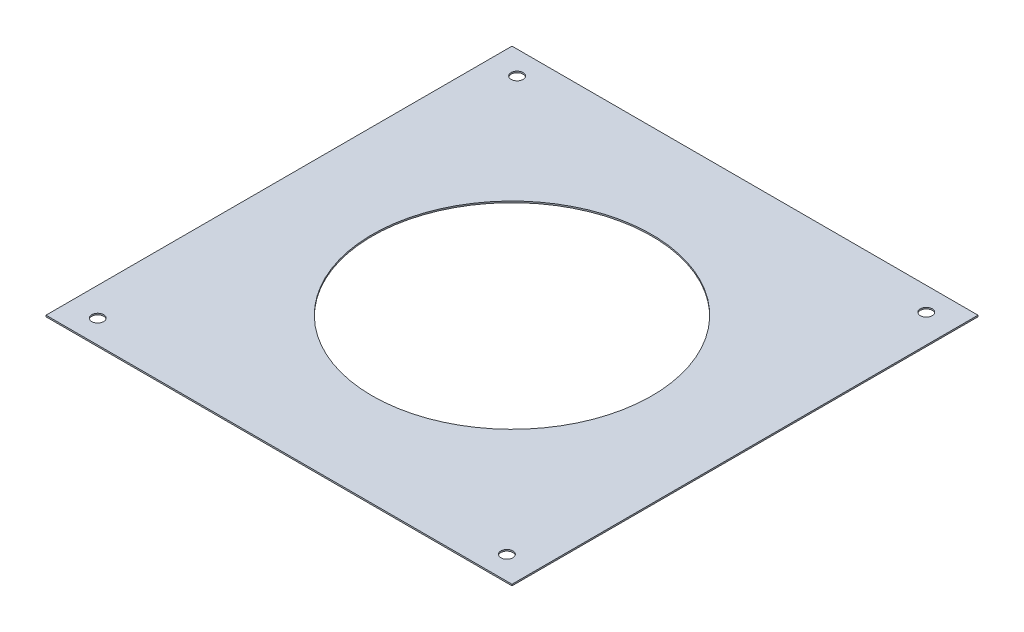
ISO-10303-21;
HEADER;
FILE_DESCRIPTION(('STEP AP214'),'2;1');
FILE_NAME('part.step','',(''),(''),'','','');
FILE_SCHEMA(('AUTOMOTIVE_DESIGN { 1 0 10303 214 1 1 1 1 }'));
ENDSEC;
DATA;
#1=APPLICATION_CONTEXT('core data for automotive mechanical design processes');
#2=APPLICATION_PROTOCOL_DEFINITION('international standard','automotive_design',2000,#1);
#3=PRODUCT_CONTEXT('',#1,'mechanical');
#4=PRODUCT('Part','Part','',(#3));
#5=PRODUCT_RELATED_PRODUCT_CATEGORY('part','',(#4));
#6=PRODUCT_DEFINITION_FORMATION('','',#4);
#7=PRODUCT_DEFINITION_CONTEXT('part definition',#1,'design');
#8=PRODUCT_DEFINITION('design','',#6,#7);
#9=PRODUCT_DEFINITION_SHAPE('','',#8);
#10=(LENGTH_UNIT() NAMED_UNIT(*) SI_UNIT(.MILLI.,.METRE.));
#11=(NAMED_UNIT(*) PLANE_ANGLE_UNIT() SI_UNIT($,.RADIAN.));
#12=(NAMED_UNIT(*) SI_UNIT($,.STERADIAN.) SOLID_ANGLE_UNIT());
#13=UNCERTAINTY_MEASURE_WITH_UNIT(LENGTH_MEASURE(1.E-05),#10,'distance_accuracy_value','');
#14=(GEOMETRIC_REPRESENTATION_CONTEXT(3) GLOBAL_UNCERTAINTY_ASSIGNED_CONTEXT((#13)) GLOBAL_UNIT_ASSIGNED_CONTEXT((#10,
#11,#12)) REPRESENTATION_CONTEXT('',''));
#15=CARTESIAN_POINT('',(0.,0.,0.));
#16=DIRECTION('',(0.,0.,1.));
#17=DIRECTION('',(1.,0.,0.));
#18=AXIS2_PLACEMENT_3D('',#15,#16,#17);
#19=CARTESIAN_POINT('',(0.,0.79375,0.));
#20=DIRECTION('',(0.,-1.,0.));
#21=DIRECTION('',(0.,0.,-1.));
#22=AXIS2_PLACEMENT_3D('',#19,#20,#21);
#23=PLANE('',#22);
#24=CARTESIAN_POINT('',(238.506,0.79375,-12.7));
#25=DIRECTION('',(0.,1.,0.));
#26=DIRECTION('',(0.,0.,1.));
#27=AXIS2_PLACEMENT_3D('',#24,#25,#26);
#28=CIRCLE('',#27,3.26389999999998);
#29=CARTESIAN_POINT('',(238.506,0.79375,-9.43610000000001));
#30=VERTEX_POINT('',#29);
#31=EDGE_CURVE('E127',#30,#30,#28,.T.);
#32=ORIENTED_EDGE('',*,*,#31,.F.);
#33=EDGE_LOOP('',(#32));
#34=FACE_BOUND('',#33,.T.);
#35=CARTESIAN_POINT('',(127.,0.79375,-127.));
#36=DIRECTION('',(0.,1.,0.));
#37=DIRECTION('',(0.,0.,1.));
#38=AXIS2_PLACEMENT_3D('',#35,#36,#37);
#39=CIRCLE('',#38,76.2);
#40=CARTESIAN_POINT('',(127.,0.79375,-50.8));
#41=VERTEX_POINT('',#40);
#42=EDGE_CURVE('E115',#41,#41,#39,.T.);
#43=ORIENTED_EDGE('',*,*,#42,.F.);
#44=EDGE_LOOP('',(#43));
#45=FACE_BOUND('',#44,.T.);
#46=DIRECTION('',(0.,0.,1.));
#47=VECTOR('',#46,1.);
#48=CARTESIAN_POINT('',(0.,0.79375,0.));
#49=LINE('',#48,#47);
#50=CARTESIAN_POINT('',(0.,0.79375,-254.));
#51=VERTEX_POINT('',#50);
#52=CARTESIAN_POINT('',(0.,0.79375,0.));
#53=VERTEX_POINT('',#52);
#54=EDGE_CURVE('E85',#51,#53,#49,.T.);
#55=ORIENTED_EDGE('',*,*,#54,.T.);
#56=DIRECTION('',(1.,0.,0.));
#57=VECTOR('',#56,1.);
#58=CARTESIAN_POINT('',(0.,0.79375,0.));
#59=LINE('',#58,#57);
#60=CARTESIAN_POINT('',(254.,0.79375,0.));
#61=VERTEX_POINT('',#60);
#62=EDGE_CURVE('E80',#53,#61,#59,.T.);
#63=ORIENTED_EDGE('',*,*,#62,.T.);
#64=DIRECTION('',(0.,0.,-1.));
#65=VECTOR('',#64,1.);
#66=CARTESIAN_POINT('',(254.,0.79375,0.));
#67=LINE('',#66,#65);
#68=CARTESIAN_POINT('',(254.,0.79375,-254.));
#69=VERTEX_POINT('',#68);
#70=EDGE_CURVE('E83',#61,#69,#67,.T.);
#71=ORIENTED_EDGE('',*,*,#70,.T.);
#72=DIRECTION('',(-1.,0.,0.));
#73=VECTOR('',#72,1.);
#74=CARTESIAN_POINT('',(0.,0.79375,-254.));
#75=LINE('',#74,#73);
#76=EDGE_CURVE('E50',#69,#51,#75,.T.);
#77=ORIENTED_EDGE('',*,*,#76,.T.);
#78=EDGE_LOOP('',(#55,#63,#71,#77));
#79=FACE_BOUND('',#78,.T.);
#80=CARTESIAN_POINT('',(15.494,0.79375,-241.3));
#81=DIRECTION('',(0.,1.,0.));
#82=DIRECTION('',(0.,0.,1.));
#83=AXIS2_PLACEMENT_3D('',#80,#81,#82);
#84=CIRCLE('',#83,3.2639);
#85=CARTESIAN_POINT('',(15.494,0.79375,-238.0361));
#86=VERTEX_POINT('',#85);
#87=EDGE_CURVE('E100',#86,#86,#84,.T.);
#88=ORIENTED_EDGE('',*,*,#87,.F.);
#89=EDGE_LOOP('',(#88));
#90=FACE_BOUND('',#89,.T.);
#91=CARTESIAN_POINT('',(238.506,0.79375,-241.3));
#92=DIRECTION('',(0.,1.,0.));
#93=DIRECTION('',(0.,0.,1.));
#94=AXIS2_PLACEMENT_3D('',#91,#92,#93);
#95=CIRCLE('',#94,3.26389999999998);
#96=CARTESIAN_POINT('',(238.506,0.79375,-238.0361));
#97=VERTEX_POINT('',#96);
#98=EDGE_CURVE('E121',#97,#97,#95,.T.);
#99=ORIENTED_EDGE('',*,*,#98,.F.);
#100=EDGE_LOOP('',(#99));
#101=FACE_BOUND('',#100,.T.);
#102=CARTESIAN_POINT('',(15.494,0.79375,-12.7));
#103=DIRECTION('',(0.,1.,0.));
#104=DIRECTION('',(0.,0.,1.));
#105=AXIS2_PLACEMENT_3D('',#102,#103,#104);
#106=CIRCLE('',#105,3.2639);
#107=CARTESIAN_POINT('',(15.494,0.79375,-9.43609999999999));
#108=VERTEX_POINT('',#107);
#109=EDGE_CURVE('E133',#108,#108,#106,.T.);
#110=ORIENTED_EDGE('',*,*,#109,.F.);
#111=EDGE_LOOP('',(#110));
#112=FACE_BOUND('',#111,.T.);
#113=ADVANCED_FACE('F33',(#34,#45,#79,#90,#101,#112),#23,.F.);
#114=CARTESIAN_POINT('',(0.,0.,0.));
#115=DIRECTION('',(0.,-1.,0.));
#116=DIRECTION('',(0.,0.,-1.));
#117=AXIS2_PLACEMENT_3D('',#114,#115,#116);
#118=PLANE('',#117);
#119=CARTESIAN_POINT('',(238.506,0.,-12.7));
#120=DIRECTION('',(0.,1.,0.));
#121=DIRECTION('',(0.,0.,1.));
#122=AXIS2_PLACEMENT_3D('',#119,#120,#121);
#123=CIRCLE('',#122,3.26389999999998);
#124=CARTESIAN_POINT('',(238.506,0.,-9.43610000000001));
#125=VERTEX_POINT('',#124);
#126=EDGE_CURVE('E130',#125,#125,#123,.T.);
#127=ORIENTED_EDGE('',*,*,#126,.T.);
#128=EDGE_LOOP('',(#127));
#129=FACE_BOUND('',#128,.T.);
#130=CARTESIAN_POINT('',(127.,0.,-127.));
#131=DIRECTION('',(0.,1.,0.));
#132=DIRECTION('',(0.,0.,1.));
#133=AXIS2_PLACEMENT_3D('',#130,#131,#132);
#134=CIRCLE('',#133,76.2);
#135=CARTESIAN_POINT('',(127.,0.,-50.8));
#136=VERTEX_POINT('',#135);
#137=EDGE_CURVE('E118',#136,#136,#134,.T.);
#138=ORIENTED_EDGE('',*,*,#137,.T.);
#139=EDGE_LOOP('',(#138));
#140=FACE_BOUND('',#139,.T.);
#141=DIRECTION('',(0.,0.,1.));
#142=VECTOR('',#141,1.);
#143=CARTESIAN_POINT('',(0.,0.,0.));
#144=LINE('',#143,#142);
#145=CARTESIAN_POINT('',(0.,0.,-254.));
#146=VERTEX_POINT('',#145);
#147=CARTESIAN_POINT('',(0.,0.,0.));
#148=VERTEX_POINT('',#147);
#149=EDGE_CURVE('E97',#146,#148,#144,.T.);
#150=ORIENTED_EDGE('',*,*,#149,.F.);
#151=DIRECTION('',(-1.,0.,0.));
#152=VECTOR('',#151,1.);
#153=CARTESIAN_POINT('',(0.,0.,-254.));
#154=LINE('',#153,#152);
#155=CARTESIAN_POINT('',(254.,0.,-254.));
#156=VERTEX_POINT('',#155);
#157=EDGE_CURVE('E73',#156,#146,#154,.T.);
#158=ORIENTED_EDGE('',*,*,#157,.F.);
#159=DIRECTION('',(0.,0.,-1.));
#160=VECTOR('',#159,1.);
#161=CARTESIAN_POINT('',(254.,0.,0.));
#162=LINE('',#161,#160);
#163=CARTESIAN_POINT('',(254.,0.,0.));
#164=VERTEX_POINT('',#163);
#165=EDGE_CURVE('E67',#164,#156,#162,.T.);
#166=ORIENTED_EDGE('',*,*,#165,.F.);
#167=DIRECTION('',(1.,0.,0.));
#168=VECTOR('',#167,1.);
#169=CARTESIAN_POINT('',(0.,0.,0.));
#170=LINE('',#169,#168);
#171=EDGE_CURVE('E89',#148,#164,#170,.T.);
#172=ORIENTED_EDGE('',*,*,#171,.F.);
#173=EDGE_LOOP('',(#150,#158,#166,#172));
#174=FACE_BOUND('',#173,.T.);
#175=CARTESIAN_POINT('',(15.494,0.,-241.3));
#176=DIRECTION('',(0.,1.,0.));
#177=DIRECTION('',(0.,0.,1.));
#178=AXIS2_PLACEMENT_3D('',#175,#176,#177);
#179=CIRCLE('',#178,3.2639);
#180=CARTESIAN_POINT('',(15.494,0.,-238.0361));
#181=VERTEX_POINT('',#180);
#182=EDGE_CURVE('E112',#181,#181,#179,.T.);
#183=ORIENTED_EDGE('',*,*,#182,.T.);
#184=EDGE_LOOP('',(#183));
#185=FACE_BOUND('',#184,.T.);
#186=CARTESIAN_POINT('',(238.506,0.,-241.3));
#187=DIRECTION('',(0.,1.,0.));
#188=DIRECTION('',(0.,0.,1.));
#189=AXIS2_PLACEMENT_3D('',#186,#187,#188);
#190=CIRCLE('',#189,3.26389999999998);
#191=CARTESIAN_POINT('',(238.506,0.,-238.0361));
#192=VERTEX_POINT('',#191);
#193=EDGE_CURVE('E124',#192,#192,#190,.T.);
#194=ORIENTED_EDGE('',*,*,#193,.T.);
#195=EDGE_LOOP('',(#194));
#196=FACE_BOUND('',#195,.T.);
#197=CARTESIAN_POINT('',(15.494,0.,-12.7));
#198=DIRECTION('',(0.,1.,0.));
#199=DIRECTION('',(0.,0.,1.));
#200=AXIS2_PLACEMENT_3D('',#197,#198,#199);
#201=CIRCLE('',#200,3.2639);
#202=CARTESIAN_POINT('',(15.494,0.,-9.43609999999999));
#203=VERTEX_POINT('',#202);
#204=EDGE_CURVE('E136',#203,#203,#201,.T.);
#205=ORIENTED_EDGE('',*,*,#204,.T.);
#206=EDGE_LOOP('',(#205));
#207=FACE_BOUND('',#206,.T.);
#208=ADVANCED_FACE('F108',(#129,#140,#174,#185,#196,#207),#118,.T.);
#209=CARTESIAN_POINT('',(0.,0.79375,0.));
#210=DIRECTION('',(1.,0.,0.));
#211=DIRECTION('',(0.,0.,-1.));
#212=AXIS2_PLACEMENT_3D('',#209,#210,#211);
#213=PLANE('',#212);
#214=ORIENTED_EDGE('',*,*,#149,.T.);
#215=DIRECTION('',(0.,-1.,0.));
#216=VECTOR('',#215,1.);
#217=CARTESIAN_POINT('',(0.,0.79375,0.));
#218=LINE('',#217,#216);
#219=EDGE_CURVE('E11',#53,#148,#218,.T.);
#220=ORIENTED_EDGE('',*,*,#219,.F.);
#221=ORIENTED_EDGE('',*,*,#54,.F.);
#222=DIRECTION('',(0.,-1.,0.));
#223=VECTOR('',#222,1.);
#224=CARTESIAN_POINT('',(0.,0.79375,-254.));
#225=LINE('',#224,#223);
#226=EDGE_CURVE('E93',#51,#146,#225,.T.);
#227=ORIENTED_EDGE('',*,*,#226,.T.);
#228=EDGE_LOOP('',(#214,#220,#221,#227));
#229=FACE_BOUND('',#228,.T.);
#230=ADVANCED_FACE('F35',(#229),#213,.F.);
#231=CARTESIAN_POINT('',(0.,0.79375,0.));
#232=DIRECTION('',(0.,0.,-1.));
#233=DIRECTION('',(-1.,0.,0.));
#234=AXIS2_PLACEMENT_3D('',#231,#232,#233);
#235=PLANE('',#234);
#236=ORIENTED_EDGE('',*,*,#171,.T.);
#237=DIRECTION('',(0.,-1.,0.));
#238=VECTOR('',#237,1.);
#239=CARTESIAN_POINT('',(254.,0.79375,0.));
#240=LINE('',#239,#238);
#241=EDGE_CURVE('E42',#61,#164,#240,.T.);
#242=ORIENTED_EDGE('',*,*,#241,.F.);
#243=ORIENTED_EDGE('',*,*,#62,.F.);
#244=ORIENTED_EDGE('',*,*,#219,.T.);
#245=EDGE_LOOP('',(#236,#242,#243,#244));
#246=FACE_BOUND('',#245,.T.);
#247=ADVANCED_FACE('F88',(#246),#235,.F.);
#248=CARTESIAN_POINT('',(254.,0.79375,0.));
#249=DIRECTION('',(-1.,0.,0.));
#250=DIRECTION('',(0.,0.,1.));
#251=AXIS2_PLACEMENT_3D('',#248,#249,#250);
#252=PLANE('',#251);
#253=ORIENTED_EDGE('',*,*,#165,.T.);
#254=DIRECTION('',(0.,-1.,0.));
#255=VECTOR('',#254,1.);
#256=CARTESIAN_POINT('',(254.,0.79375,-254.));
#257=LINE('',#256,#255);
#258=EDGE_CURVE('E90',#69,#156,#257,.T.);
#259=ORIENTED_EDGE('',*,*,#258,.F.);
#260=ORIENTED_EDGE('',*,*,#70,.F.);
#261=ORIENTED_EDGE('',*,*,#241,.T.);
#262=EDGE_LOOP('',(#253,#259,#260,#261));
#263=FACE_BOUND('',#262,.T.);
#264=ADVANCED_FACE('F91',(#263),#252,.F.);
#265=CARTESIAN_POINT('',(0.,0.79375,-254.));
#266=DIRECTION('',(0.,0.,1.));
#267=DIRECTION('',(1.,0.,0.));
#268=AXIS2_PLACEMENT_3D('',#265,#266,#267);
#269=PLANE('',#268);
#270=ORIENTED_EDGE('',*,*,#157,.T.);
#271=ORIENTED_EDGE('',*,*,#226,.F.);
#272=ORIENTED_EDGE('',*,*,#76,.F.);
#273=ORIENTED_EDGE('',*,*,#258,.T.);
#274=EDGE_LOOP('',(#270,#271,#272,#273));
#275=FACE_BOUND('',#274,.T.);
#276=ADVANCED_FACE('F105',(#275),#269,.F.);
#277=CARTESIAN_POINT('',(15.494,0.79375,-241.3));
#278=DIRECTION('',(0.,-1.,0.));
#279=DIRECTION('',(0.,0.,-1.));
#280=AXIS2_PLACEMENT_3D('',#277,#278,#279);
#281=CYLINDRICAL_SURFACE('',#280,3.2639);
#282=ORIENTED_EDGE('',*,*,#87,.T.);
#283=EDGE_LOOP('',(#282));
#284=FACE_BOUND('',#283,.T.);
#285=ORIENTED_EDGE('',*,*,#182,.F.);
#286=EDGE_LOOP('',(#285));
#287=FACE_BOUND('',#286,.T.);
#288=ADVANCED_FACE('F156',(#284,#287),#281,.F.);
#289=CARTESIAN_POINT('',(127.,0.79375,-127.));
#290=DIRECTION('',(0.,-1.,0.));
#291=DIRECTION('',(0.,0.,-1.));
#292=AXIS2_PLACEMENT_3D('',#289,#290,#291);
#293=CYLINDRICAL_SURFACE('',#292,76.2);
#294=ORIENTED_EDGE('',*,*,#42,.T.);
#295=EDGE_LOOP('',(#294));
#296=FACE_BOUND('',#295,.T.);
#297=ORIENTED_EDGE('',*,*,#137,.F.);
#298=EDGE_LOOP('',(#297));
#299=FACE_BOUND('',#298,.T.);
#300=ADVANCED_FACE('F202',(#296,#299),#293,.F.);
#301=CARTESIAN_POINT('',(238.506,0.79375,-241.3));
#302=DIRECTION('',(0.,-1.,0.));
#303=DIRECTION('',(0.,0.,-1.));
#304=AXIS2_PLACEMENT_3D('',#301,#302,#303);
#305=CYLINDRICAL_SURFACE('',#304,3.26389999999998);
#306=ORIENTED_EDGE('',*,*,#98,.T.);
#307=EDGE_LOOP('',(#306));
#308=FACE_BOUND('',#307,.T.);
#309=ORIENTED_EDGE('',*,*,#193,.F.);
#310=EDGE_LOOP('',(#309));
#311=FACE_BOUND('',#310,.T.);
#312=ADVANCED_FACE('F210',(#308,#311),#305,.F.);
#313=CARTESIAN_POINT('',(238.506,0.79375,-12.7));
#314=DIRECTION('',(0.,-1.,0.));
#315=DIRECTION('',(0.,0.,-1.));
#316=AXIS2_PLACEMENT_3D('',#313,#314,#315);
#317=CYLINDRICAL_SURFACE('',#316,3.26389999999998);
#318=ORIENTED_EDGE('',*,*,#31,.T.);
#319=EDGE_LOOP('',(#318));
#320=FACE_BOUND('',#319,.T.);
#321=ORIENTED_EDGE('',*,*,#126,.F.);
#322=EDGE_LOOP('',(#321));
#323=FACE_BOUND('',#322,.T.);
#324=ADVANCED_FACE('F218',(#320,#323),#317,.F.);
#325=CARTESIAN_POINT('',(15.494,0.79375,-12.7));
#326=DIRECTION('',(0.,-1.,0.));
#327=DIRECTION('',(0.,0.,-1.));
#328=AXIS2_PLACEMENT_3D('',#325,#326,#327);
#329=CYLINDRICAL_SURFACE('',#328,3.2639);
#330=ORIENTED_EDGE('',*,*,#109,.T.);
#331=EDGE_LOOP('',(#330));
#332=FACE_BOUND('',#331,.T.);
#333=ORIENTED_EDGE('',*,*,#204,.F.);
#334=EDGE_LOOP('',(#333));
#335=FACE_BOUND('',#334,.T.);
#336=ADVANCED_FACE('F142',(#332,#335),#329,.F.);
#337=CLOSED_SHELL('',(#113,#208,#230,#247,#264,#276,#288,#300,#312,#324,#336));
#338=MANIFOLD_SOLID_BREP('B2',#337);
#339=ADVANCED_BREP_SHAPE_REPRESENTATION('',(#18,#338),#14);
#340=SHAPE_DEFINITION_REPRESENTATION(#9,#339);
ENDSEC;
END-ISO-10303-21;
